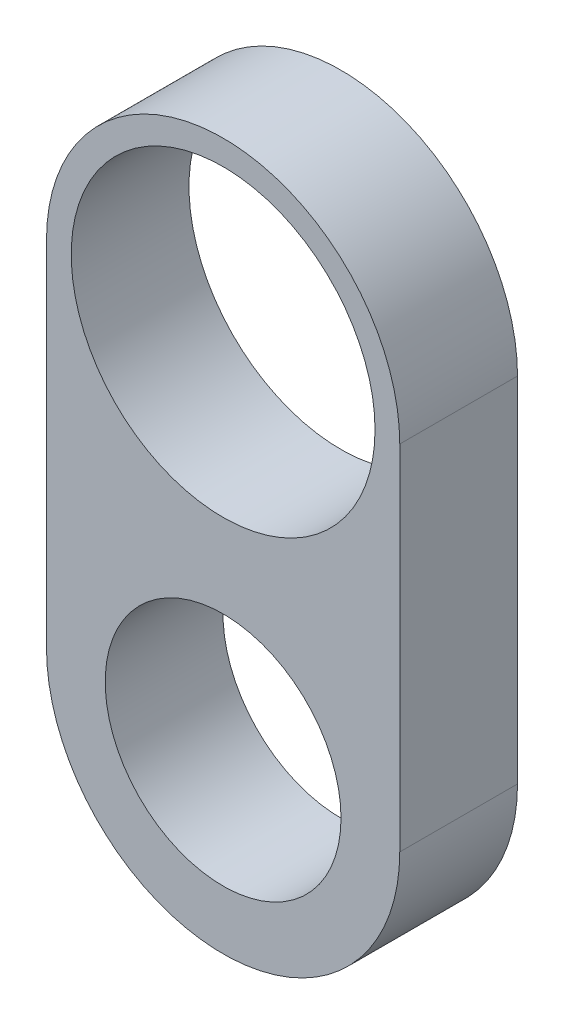
ISO-10303-21;
HEADER;
FILE_DESCRIPTION(('STEP AP214'),'2;1');
FILE_NAME('part.step','',(''),(''),'','','');
FILE_SCHEMA(('AUTOMOTIVE_DESIGN { 1 0 10303 214 1 1 1 1 }'));
ENDSEC;
DATA;
#1=APPLICATION_CONTEXT('core data for automotive mechanical design processes');
#2=APPLICATION_PROTOCOL_DEFINITION('international standard','automotive_design',2000,#1);
#3=PRODUCT_CONTEXT('',#1,'mechanical');
#4=PRODUCT('Part','Part','',(#3));
#5=PRODUCT_RELATED_PRODUCT_CATEGORY('part','',(#4));
#6=PRODUCT_DEFINITION_FORMATION('','',#4);
#7=PRODUCT_DEFINITION_CONTEXT('part definition',#1,'design');
#8=PRODUCT_DEFINITION('design','',#6,#7);
#9=PRODUCT_DEFINITION_SHAPE('','',#8);
#10=(LENGTH_UNIT() NAMED_UNIT(*) SI_UNIT(.MILLI.,.METRE.));
#11=(NAMED_UNIT(*) PLANE_ANGLE_UNIT() SI_UNIT($,.RADIAN.));
#12=(NAMED_UNIT(*) SI_UNIT($,.STERADIAN.) SOLID_ANGLE_UNIT());
#13=UNCERTAINTY_MEASURE_WITH_UNIT(LENGTH_MEASURE(1.E-05),#10,'distance_accuracy_value','');
#14=(GEOMETRIC_REPRESENTATION_CONTEXT(3) GLOBAL_UNCERTAINTY_ASSIGNED_CONTEXT((#13)) GLOBAL_UNIT_ASSIGNED_CONTEXT((#10,
#11,#12)) REPRESENTATION_CONTEXT('',''));
#15=CARTESIAN_POINT('',(0.,0.,0.));
#16=DIRECTION('',(0.,0.,1.));
#17=DIRECTION('',(1.,0.,0.));
#18=AXIS2_PLACEMENT_3D('',#15,#16,#17);
#19=CARTESIAN_POINT('',(0.,0.,12.7));
#20=DIRECTION('',(0.,0.,-1.));
#21=DIRECTION('',(-1.,0.,0.));
#22=AXIS2_PLACEMENT_3D('',#19,#20,#21);
#23=CYLINDRICAL_SURFACE('',#22,19.05);
#24=CARTESIAN_POINT('',(0.,0.,0.));
#25=DIRECTION('',(0.,0.,1.));
#26=DIRECTION('',(1.,0.,0.));
#27=AXIS2_PLACEMENT_3D('',#24,#25,#26);
#28=CIRCLE('',#27,19.05);
#29=CARTESIAN_POINT('',(-19.05,0.,0.));
#30=VERTEX_POINT('',#29);
#31=CARTESIAN_POINT('',(19.05,0.,0.));
#32=VERTEX_POINT('',#31);
#33=EDGE_CURVE('E109',#30,#32,#28,.T.);
#34=ORIENTED_EDGE('',*,*,#33,.T.);
#35=DIRECTION('',(0.,0.,-1.));
#36=VECTOR('',#35,1.);
#37=CARTESIAN_POINT('',(19.05,0.,12.7));
#38=LINE('',#37,#36);
#39=CARTESIAN_POINT('',(19.05,0.,12.7));
#40=VERTEX_POINT('',#39);
#41=EDGE_CURVE('E11',#40,#32,#38,.T.);
#42=ORIENTED_EDGE('',*,*,#41,.F.);
#43=CARTESIAN_POINT('',(0.,0.,12.7));
#44=DIRECTION('',(0.,0.,1.));
#45=DIRECTION('',(1.,0.,0.));
#46=AXIS2_PLACEMENT_3D('',#43,#44,#45);
#47=CIRCLE('',#46,19.05);
#48=CARTESIAN_POINT('',(-19.05,0.,12.7));
#49=VERTEX_POINT('',#48);
#50=EDGE_CURVE('E92',#49,#40,#47,.T.);
#51=ORIENTED_EDGE('',*,*,#50,.F.);
#52=DIRECTION('',(0.,0.,-1.));
#53=VECTOR('',#52,1.);
#54=CARTESIAN_POINT('',(-19.05,0.,12.7));
#55=LINE('',#54,#53);
#56=EDGE_CURVE('E105',#49,#30,#55,.T.);
#57=ORIENTED_EDGE('',*,*,#56,.T.);
#58=EDGE_LOOP('',(#34,#42,#51,#57));
#59=FACE_BOUND('',#58,.T.);
#60=ADVANCED_FACE('F40',(#59),#23,.T.);
#61=CARTESIAN_POINT('',(19.05,0.,12.7));
#62=DIRECTION('',(-1.,0.,0.));
#63=DIRECTION('',(0.,-1.,0.));
#64=AXIS2_PLACEMENT_3D('',#61,#62,#63);
#65=PLANE('',#64);
#66=DIRECTION('',(0.,1.,0.));
#67=VECTOR('',#66,1.);
#68=CARTESIAN_POINT('',(19.05,0.,0.));
#69=LINE('',#68,#67);
#70=CARTESIAN_POINT('',(19.05,38.1,0.));
#71=VERTEX_POINT('',#70);
#72=EDGE_CURVE('E97',#32,#71,#69,.T.);
#73=ORIENTED_EDGE('',*,*,#72,.T.);
#74=DIRECTION('',(0.,0.,-1.));
#75=VECTOR('',#74,1.);
#76=CARTESIAN_POINT('',(19.05,38.1,12.7));
#77=LINE('',#76,#75);
#78=CARTESIAN_POINT('',(19.05,38.1,12.7));
#79=VERTEX_POINT('',#78);
#80=EDGE_CURVE('E49',#79,#71,#77,.T.);
#81=ORIENTED_EDGE('',*,*,#80,.F.);
#82=DIRECTION('',(0.,1.,0.));
#83=VECTOR('',#82,1.);
#84=CARTESIAN_POINT('',(19.05,0.,12.7));
#85=LINE('',#84,#83);
#86=EDGE_CURVE('E87',#40,#79,#85,.T.);
#87=ORIENTED_EDGE('',*,*,#86,.F.);
#88=ORIENTED_EDGE('',*,*,#41,.T.);
#89=EDGE_LOOP('',(#73,#81,#87,#88));
#90=FACE_BOUND('',#89,.T.);
#91=ADVANCED_FACE('F96',(#90),#65,.F.);
#92=CARTESIAN_POINT('',(0.,38.1,12.7));
#93=DIRECTION('',(0.,0.,-1.));
#94=DIRECTION('',(-1.,0.,0.));
#95=AXIS2_PLACEMENT_3D('',#92,#93,#94);
#96=CYLINDRICAL_SURFACE('',#95,19.05);
#97=CARTESIAN_POINT('',(0.,38.1,0.));
#98=DIRECTION('',(0.,0.,1.));
#99=DIRECTION('',(1.,0.,0.));
#100=AXIS2_PLACEMENT_3D('',#97,#98,#99);
#101=CIRCLE('',#100,19.05);
#102=CARTESIAN_POINT('',(-19.05,38.1,0.));
#103=VERTEX_POINT('',#102);
#104=EDGE_CURVE('E74',#71,#103,#101,.T.);
#105=ORIENTED_EDGE('',*,*,#104,.T.);
#106=DIRECTION('',(0.,0.,-1.));
#107=VECTOR('',#106,1.);
#108=CARTESIAN_POINT('',(-19.05,38.1,12.7));
#109=LINE('',#108,#107);
#110=CARTESIAN_POINT('',(-19.05,38.1,12.7));
#111=VERTEX_POINT('',#110);
#112=EDGE_CURVE('E99',#111,#103,#109,.T.);
#113=ORIENTED_EDGE('',*,*,#112,.F.);
#114=CARTESIAN_POINT('',(0.,38.1,12.7));
#115=DIRECTION('',(0.,0.,1.));
#116=DIRECTION('',(1.,0.,0.));
#117=AXIS2_PLACEMENT_3D('',#114,#115,#116);
#118=CIRCLE('',#117,19.05);
#119=EDGE_CURVE('E90',#79,#111,#118,.T.);
#120=ORIENTED_EDGE('',*,*,#119,.F.);
#121=ORIENTED_EDGE('',*,*,#80,.T.);
#122=EDGE_LOOP('',(#105,#113,#120,#121));
#123=FACE_BOUND('',#122,.T.);
#124=ADVANCED_FACE('F100',(#123),#96,.T.);
#125=CARTESIAN_POINT('',(-19.05,0.,12.7));
#126=DIRECTION('',(1.,0.,0.));
#127=DIRECTION('',(0.,1.,0.));
#128=AXIS2_PLACEMENT_3D('',#125,#126,#127);
#129=PLANE('',#128);
#130=DIRECTION('',(0.,-1.,0.));
#131=VECTOR('',#130,1.);
#132=CARTESIAN_POINT('',(-19.05,0.,0.));
#133=LINE('',#132,#131);
#134=EDGE_CURVE('E80',#103,#30,#133,.T.);
#135=ORIENTED_EDGE('',*,*,#134,.T.);
#136=ORIENTED_EDGE('',*,*,#56,.F.);
#137=DIRECTION('',(0.,-1.,0.));
#138=VECTOR('',#137,1.);
#139=CARTESIAN_POINT('',(-19.05,0.,12.7));
#140=LINE('',#139,#138);
#141=EDGE_CURVE('E57',#111,#49,#140,.T.);
#142=ORIENTED_EDGE('',*,*,#141,.F.);
#143=ORIENTED_EDGE('',*,*,#112,.T.);
#144=EDGE_LOOP('',(#135,#136,#142,#143));
#145=FACE_BOUND('',#144,.T.);
#146=ADVANCED_FACE('F124',(#145),#129,.F.);
#147=CARTESIAN_POINT('',(0.,0.,12.7));
#148=DIRECTION('',(0.,0.,1.));
#149=DIRECTION('',(1.,0.,0.));
#150=AXIS2_PLACEMENT_3D('',#147,#148,#149);
#151=PLANE('',#150);
#152=CARTESIAN_POINT('',(0.,38.1,12.7));
#153=DIRECTION('',(0.,0.,1.));
#154=DIRECTION('',(1.,0.,0.));
#155=AXIS2_PLACEMENT_3D('',#152,#153,#154);
#156=CIRCLE('',#155,16.383);
#157=CARTESIAN_POINT('',(16.383,38.1,12.7));
#158=VERTEX_POINT('',#157);
#159=EDGE_CURVE('E139',#158,#158,#156,.T.);
#160=ORIENTED_EDGE('',*,*,#159,.F.);
#161=EDGE_LOOP('',(#160));
#162=FACE_BOUND('',#161,.T.);
#163=CARTESIAN_POINT('',(0.,0.,12.7));
#164=DIRECTION('',(0.,0.,1.));
#165=DIRECTION('',(1.,0.,0.));
#166=AXIS2_PLACEMENT_3D('',#163,#164,#165);
#167=CIRCLE('',#166,12.71524);
#168=CARTESIAN_POINT('',(12.71524,0.,12.7));
#169=VERTEX_POINT('',#168);
#170=EDGE_CURVE('E113',#169,#169,#167,.T.);
#171=ORIENTED_EDGE('',*,*,#170,.F.);
#172=EDGE_LOOP('',(#171));
#173=FACE_BOUND('',#172,.T.);
#174=ORIENTED_EDGE('',*,*,#50,.T.);
#175=ORIENTED_EDGE('',*,*,#86,.T.);
#176=ORIENTED_EDGE('',*,*,#119,.T.);
#177=ORIENTED_EDGE('',*,*,#141,.T.);
#178=EDGE_LOOP('',(#174,#175,#176,#177));
#179=FACE_BOUND('',#178,.T.);
#180=ADVANCED_FACE('F88',(#162,#173,#179),#151,.T.);
#181=CARTESIAN_POINT('',(0.,0.,0.));
#182=DIRECTION('',(0.,0.,1.));
#183=DIRECTION('',(1.,0.,0.));
#184=AXIS2_PLACEMENT_3D('',#181,#182,#183);
#185=PLANE('',#184);
#186=CARTESIAN_POINT('',(0.,38.1,0.));
#187=DIRECTION('',(0.,0.,1.));
#188=DIRECTION('',(1.,0.,0.));
#189=AXIS2_PLACEMENT_3D('',#186,#187,#188);
#190=CIRCLE('',#189,16.383);
#191=CARTESIAN_POINT('',(16.383,38.1,0.));
#192=VERTEX_POINT('',#191);
#193=EDGE_CURVE('E143',#192,#192,#190,.T.);
#194=ORIENTED_EDGE('',*,*,#193,.T.);
#195=EDGE_LOOP('',(#194));
#196=FACE_BOUND('',#195,.T.);
#197=CARTESIAN_POINT('',(0.,0.,0.));
#198=DIRECTION('',(0.,0.,1.));
#199=DIRECTION('',(1.,0.,0.));
#200=AXIS2_PLACEMENT_3D('',#197,#198,#199);
#201=CIRCLE('',#200,12.71524);
#202=CARTESIAN_POINT('',(12.71524,0.,0.));
#203=VERTEX_POINT('',#202);
#204=EDGE_CURVE('E135',#203,#203,#201,.T.);
#205=ORIENTED_EDGE('',*,*,#204,.T.);
#206=EDGE_LOOP('',(#205));
#207=FACE_BOUND('',#206,.T.);
#208=ORIENTED_EDGE('',*,*,#33,.F.);
#209=ORIENTED_EDGE('',*,*,#134,.F.);
#210=ORIENTED_EDGE('',*,*,#104,.F.);
#211=ORIENTED_EDGE('',*,*,#72,.F.);
#212=EDGE_LOOP('',(#208,#209,#210,#211));
#213=FACE_BOUND('',#212,.T.);
#214=ADVANCED_FACE('F127',(#196,#207,#213),#185,.F.);
#215=CARTESIAN_POINT('',(0.,0.,0.));
#216=DIRECTION('',(0.,0.,1.));
#217=DIRECTION('',(1.,0.,0.));
#218=AXIS2_PLACEMENT_3D('',#215,#216,#217);
#219=CYLINDRICAL_SURFACE('',#218,12.71524);
#220=ORIENTED_EDGE('',*,*,#170,.T.);
#221=EDGE_LOOP('',(#220));
#222=FACE_BOUND('',#221,.T.);
#223=ORIENTED_EDGE('',*,*,#204,.F.);
#224=EDGE_LOOP('',(#223));
#225=FACE_BOUND('',#224,.T.);
#226=ADVANCED_FACE('F153',(#222,#225),#219,.F.);
#227=CARTESIAN_POINT('',(0.,38.1,0.));
#228=DIRECTION('',(0.,0.,1.));
#229=DIRECTION('',(1.,0.,0.));
#230=AXIS2_PLACEMENT_3D('',#227,#228,#229);
#231=CYLINDRICAL_SURFACE('',#230,16.383);
#232=ORIENTED_EDGE('',*,*,#159,.T.);
#233=EDGE_LOOP('',(#232));
#234=FACE_BOUND('',#233,.T.);
#235=ORIENTED_EDGE('',*,*,#193,.F.);
#236=EDGE_LOOP('',(#235));
#237=FACE_BOUND('',#236,.T.);
#238=ADVANCED_FACE('F151',(#234,#237),#231,.F.);
#239=CLOSED_SHELL('',(#60,#91,#124,#146,#180,#214,#226,#238));
#240=MANIFOLD_SOLID_BREP('B2',#239);
#241=ADVANCED_BREP_SHAPE_REPRESENTATION('',(#18,#240),#14);
#242=SHAPE_DEFINITION_REPRESENTATION(#9,#241);
ENDSEC;
END-ISO-10303-21;
